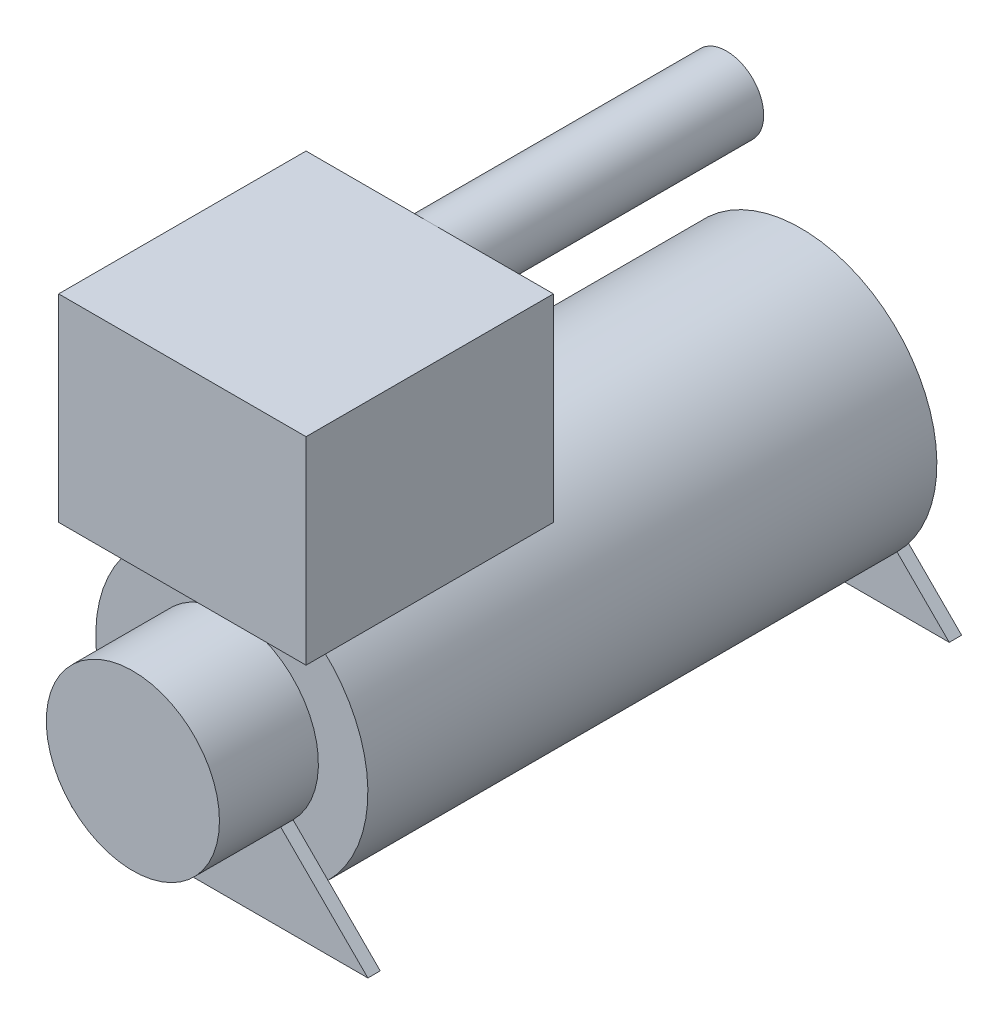
ISO-10303-21;
HEADER;
FILE_DESCRIPTION(('STEP AP214'),'2;1');
FILE_NAME('part.step','',(''),(''),'','','');
FILE_SCHEMA(('AUTOMOTIVE_DESIGN { 1 0 10303 214 1 1 1 1 }'));
ENDSEC;
DATA;
#1=APPLICATION_CONTEXT('core data for automotive mechanical design processes');
#2=APPLICATION_PROTOCOL_DEFINITION('international standard','automotive_design',2000,#1);
#3=PRODUCT_CONTEXT('',#1,'mechanical');
#4=PRODUCT('Part','Part','',(#3));
#5=PRODUCT_RELATED_PRODUCT_CATEGORY('part','',(#4));
#6=PRODUCT_DEFINITION_FORMATION('','',#4);
#7=PRODUCT_DEFINITION_CONTEXT('part definition',#1,'design');
#8=PRODUCT_DEFINITION('design','',#6,#7);
#9=PRODUCT_DEFINITION_SHAPE('','',#8);
#10=(LENGTH_UNIT() NAMED_UNIT(*) SI_UNIT(.MILLI.,.METRE.));
#11=(NAMED_UNIT(*) PLANE_ANGLE_UNIT() SI_UNIT($,.RADIAN.));
#12=(NAMED_UNIT(*) SI_UNIT($,.STERADIAN.) SOLID_ANGLE_UNIT());
#13=UNCERTAINTY_MEASURE_WITH_UNIT(LENGTH_MEASURE(1.E-05),#10,'distance_accuracy_value','');
#14=(GEOMETRIC_REPRESENTATION_CONTEXT(3) GLOBAL_UNCERTAINTY_ASSIGNED_CONTEXT((#13)) GLOBAL_UNIT_ASSIGNED_CONTEXT((#10,
#11,#12)) REPRESENTATION_CONTEXT('',''));
#15=CARTESIAN_POINT('',(0.,0.,0.));
#16=DIRECTION('',(0.,0.,1.));
#17=DIRECTION('',(1.,0.,0.));
#18=AXIS2_PLACEMENT_3D('',#15,#16,#17);
#19=CARTESIAN_POINT('',(0.,0.,146.05));
#20=DIRECTION('',(0.,0.,-1.));
#21=DIRECTION('',(-1.,0.,0.));
#22=AXIS2_PLACEMENT_3D('',#19,#20,#21);
#23=CYLINDRICAL_SURFACE('',#22,34.925);
#24=CARTESIAN_POINT('',(0.,0.,0.));
#25=DIRECTION('',(0.,0.,1.));
#26=DIRECTION('',(1.,0.,0.));
#27=AXIS2_PLACEMENT_3D('',#24,#25,#26);
#28=CIRCLE('',#27,34.925);
#29=CARTESIAN_POINT('',(-24.6957043329402,-24.6957043329402,0.));
#30=VERTEX_POINT('',#29);
#31=CARTESIAN_POINT('',(24.6957043329402,-24.6957043329402,0.));
#32=VERTEX_POINT('',#31);
#33=EDGE_CURVE('E256',#30,#32,#28,.T.);
#34=ORIENTED_EDGE('',*,*,#33,.T.);
#35=EDGE_CURVE('E250',#32,#30,#28,.T.);
#36=ORIENTED_EDGE('',*,*,#35,.T.);
#37=EDGE_LOOP('',(#34,#36));
#38=FACE_BOUND('',#37,.T.);
#39=DIRECTION('',(0.,0.,-1.));
#40=VECTOR('',#39,1.);
#41=CARTESIAN_POINT('',(11.3769602706523,33.02,146.05));
#42=LINE('',#41,#40);
#43=CARTESIAN_POINT('',(11.3769602706523,33.02,146.05));
#44=VERTEX_POINT('',#43);
#45=CARTESIAN_POINT('',(11.3769602706523,33.02,95.25));
#46=VERTEX_POINT('',#45);
#47=EDGE_CURVE('E191',#44,#46,#42,.T.);
#48=ORIENTED_EDGE('',*,*,#47,.F.);
#49=CARTESIAN_POINT('',(0.,0.,146.05));
#50=DIRECTION('',(0.,0.,1.));
#51=DIRECTION('',(1.,0.,0.));
#52=AXIS2_PLACEMENT_3D('',#49,#50,#51);
#53=CIRCLE('',#52,34.925);
#54=CARTESIAN_POINT('',(24.6957043329402,-24.6957043329402,146.05));
#55=VERTEX_POINT('',#54);
#56=EDGE_CURVE('E254',#55,#44,#53,.T.);
#57=ORIENTED_EDGE('',*,*,#56,.F.);
#58=CARTESIAN_POINT('',(-24.6957043329402,-24.6957043329402,146.05));
#59=VERTEX_POINT('',#58);
#60=EDGE_CURVE('E251',#59,#55,#53,.T.);
#61=ORIENTED_EDGE('',*,*,#60,.F.);
#62=CARTESIAN_POINT('',(-11.3769602706523,33.02,146.05));
#63=VERTEX_POINT('',#62);
#64=EDGE_CURVE('E255',#63,#59,#53,.T.);
#65=ORIENTED_EDGE('',*,*,#64,.F.);
#66=DIRECTION('',(0.,0.,-1.));
#67=VECTOR('',#66,1.);
#68=CARTESIAN_POINT('',(-11.3769602706523,33.02,146.05));
#69=LINE('',#68,#67);
#70=CARTESIAN_POINT('',(-11.3769602706523,33.02,95.25));
#71=VERTEX_POINT('',#70);
#72=EDGE_CURVE('E51',#71,#63,#69,.F.);
#73=ORIENTED_EDGE('',*,*,#72,.F.);
#74=CARTESIAN_POINT('',(0.,0.,95.25));
#75=DIRECTION('',(0.,0.,1.));
#76=DIRECTION('',(1.,0.,0.));
#77=AXIS2_PLACEMENT_3D('',#74,#75,#76);
#78=CIRCLE('',#77,34.925);
#79=EDGE_CURVE('E11',#46,#71,#78,.T.);
#80=ORIENTED_EDGE('',*,*,#79,.F.);
#81=EDGE_LOOP('',(#48,#57,#61,#65,#73,#80));
#82=FACE_BOUND('',#81,.T.);
#83=ADVANCED_FACE('F37',(#38,#82),#23,.T.);
#84=CARTESIAN_POINT('',(0.,0.,146.05));
#85=DIRECTION('',(0.,0.,1.));
#86=DIRECTION('',(1.,0.,0.));
#87=AXIS2_PLACEMENT_3D('',#84,#85,#86);
#88=PLANE('',#87);
#89=ORIENTED_EDGE('',*,*,#56,.T.);
#90=DIRECTION('',(-1.,0.,0.));
#91=VECTOR('',#90,1.);
#92=CARTESIAN_POINT('',(0.,33.02,146.05));
#93=LINE('',#92,#91);
#94=EDGE_CURVE('E44',#44,#63,#93,.T.);
#95=ORIENTED_EDGE('',*,*,#94,.T.);
#96=ORIENTED_EDGE('',*,*,#64,.T.);
#97=DIRECTION('',(-0.707106781186547,-0.707106781186547,0.));
#98=VECTOR('',#97,1.);
#99=CARTESIAN_POINT('',(0.,0.,146.05));
#100=LINE('',#99,#98);
#101=CARTESIAN_POINT('',(-15.715448211871,-15.715448211871,146.05));
#102=VERTEX_POINT('',#101);
#103=EDGE_CURVE('E241',#102,#59,#100,.T.);
#104=ORIENTED_EDGE('',*,*,#103,.F.);
#105=CARTESIAN_POINT('',(0.,0.,146.05));
#106=DIRECTION('',(0.,0.,1.));
#107=DIRECTION('',(1.,0.,0.));
#108=AXIS2_PLACEMENT_3D('',#105,#106,#107);
#109=CIRCLE('',#108,22.225);
#110=CARTESIAN_POINT('',(15.715448211871,-15.715448211871,146.05));
#111=VERTEX_POINT('',#110);
#112=EDGE_CURVE('E193',#111,#102,#109,.T.);
#113=ORIENTED_EDGE('',*,*,#112,.F.);
#114=DIRECTION('',(-0.707106781186547,0.707106781186547,0.));
#115=VECTOR('',#114,1.);
#116=CARTESIAN_POINT('',(38.1,-38.1,146.05));
#117=LINE('',#116,#115);
#118=EDGE_CURVE('E240',#55,#111,#117,.T.);
#119=ORIENTED_EDGE('',*,*,#118,.F.);
#120=EDGE_LOOP('',(#89,#95,#96,#104,#113,#119));
#121=FACE_BOUND('',#120,.T.);
#122=ADVANCED_FACE('F263',(#121),#88,.T.);
#123=CARTESIAN_POINT('',(38.1,-38.1,149.225));
#124=DIRECTION('',(-0.707106781186548,-0.707106781186548,0.));
#125=DIRECTION('',(0.707106781186548,-0.707106781186548,0.));
#126=AXIS2_PLACEMENT_3D('',#123,#124,#125);
#127=PLANE('',#126);
#128=DIRECTION('',(0.,0.,-1.));
#129=VECTOR('',#128,1.);
#130=CARTESIAN_POINT('',(15.715448211871,-15.715448211871,171.45));
#131=LINE('',#130,#129);
#132=CARTESIAN_POINT('',(15.715448211871,-15.715448211871,149.225));
#133=VERTEX_POINT('',#132);
#134=EDGE_CURVE('E199',#133,#111,#131,.T.);
#135=ORIENTED_EDGE('',*,*,#134,.F.);
#136=DIRECTION('',(-0.707106781186547,0.707106781186547,0.));
#137=VECTOR('',#136,1.);
#138=CARTESIAN_POINT('',(38.1,-38.1,149.225));
#139=LINE('',#138,#137);
#140=CARTESIAN_POINT('',(38.1,-38.1,149.225));
#141=VERTEX_POINT('',#140);
#142=EDGE_CURVE('E228',#141,#133,#139,.T.);
#143=ORIENTED_EDGE('',*,*,#142,.F.);
#144=DIRECTION('',(0.,0.,-1.));
#145=VECTOR('',#144,1.);
#146=CARTESIAN_POINT('',(38.1,-38.1,149.225));
#147=LINE('',#146,#145);
#148=CARTESIAN_POINT('',(38.1,-38.1,146.05));
#149=VERTEX_POINT('',#148);
#150=EDGE_CURVE('E236',#141,#149,#147,.T.);
#151=ORIENTED_EDGE('',*,*,#150,.T.);
#152=EDGE_CURVE('E227',#149,#55,#117,.T.);
#153=ORIENTED_EDGE('',*,*,#152,.T.);
#154=ORIENTED_EDGE('',*,*,#118,.T.);
#155=EDGE_LOOP('',(#135,#143,#151,#153,#154));
#156=FACE_BOUND('',#155,.T.);
#157=ADVANCED_FACE('F290',(#156),#127,.F.);
#158=CARTESIAN_POINT('',(0.,0.,149.225));
#159=DIRECTION('',(0.707106781186548,-0.707106781186548,0.));
#160=DIRECTION('',(0.707106781186548,0.707106781186548,0.));
#161=AXIS2_PLACEMENT_3D('',#158,#159,#160);
#162=PLANE('',#161);
#163=DIRECTION('',(0.,0.,-1.));
#164=VECTOR('',#163,1.);
#165=CARTESIAN_POINT('',(-15.715448211871,-15.715448211871,171.45));
#166=LINE('',#165,#164);
#167=CARTESIAN_POINT('',(-15.715448211871,-15.715448211871,149.225));
#168=VERTEX_POINT('',#167);
#169=EDGE_CURVE('E59',#102,#168,#166,.F.);
#170=ORIENTED_EDGE('',*,*,#169,.F.);
#171=ORIENTED_EDGE('',*,*,#103,.T.);
#172=CARTESIAN_POINT('',(-38.1,-38.1,146.05));
#173=VERTEX_POINT('',#172);
#174=EDGE_CURVE('E239',#59,#173,#100,.T.);
#175=ORIENTED_EDGE('',*,*,#174,.T.);
#176=DIRECTION('',(0.,0.,-1.));
#177=VECTOR('',#176,1.);
#178=CARTESIAN_POINT('',(-38.1,-38.1,149.225));
#179=LINE('',#178,#177);
#180=CARTESIAN_POINT('',(-38.1,-38.1,149.225));
#181=VERTEX_POINT('',#180);
#182=EDGE_CURVE('E247',#181,#173,#179,.T.);
#183=ORIENTED_EDGE('',*,*,#182,.F.);
#184=DIRECTION('',(-0.707106781186547,-0.707106781186547,0.));
#185=VECTOR('',#184,1.);
#186=CARTESIAN_POINT('',(0.,0.,149.225));
#187=LINE('',#186,#185);
#188=EDGE_CURVE('E231',#168,#181,#187,.T.);
#189=ORIENTED_EDGE('',*,*,#188,.F.);
#190=EDGE_LOOP('',(#170,#171,#175,#183,#189));
#191=FACE_BOUND('',#190,.T.);
#192=ADVANCED_FACE('F277',(#191),#162,.F.);
#193=CARTESIAN_POINT('',(0.,0.,0.));
#194=DIRECTION('',(0.,0.,1.));
#195=DIRECTION('',(1.,0.,0.));
#196=AXIS2_PLACEMENT_3D('',#193,#194,#195);
#197=PLANE('',#196);
#198=ORIENTED_EDGE('',*,*,#35,.F.);
#199=DIRECTION('',(-0.707106781186547,0.707106781186547,0.));
#200=VECTOR('',#199,1.);
#201=CARTESIAN_POINT('',(38.1,-38.1,0.));
#202=LINE('',#201,#200);
#203=CARTESIAN_POINT('',(0.,0.,0.));
#204=VERTEX_POINT('',#203);
#205=EDGE_CURVE('E207',#32,#204,#202,.T.);
#206=ORIENTED_EDGE('',*,*,#205,.T.);
#207=DIRECTION('',(-0.707106781186547,-0.707106781186547,0.));
#208=VECTOR('',#207,1.);
#209=CARTESIAN_POINT('',(0.,0.,0.));
#210=LINE('',#209,#208);
#211=EDGE_CURVE('E208',#204,#30,#210,.T.);
#212=ORIENTED_EDGE('',*,*,#211,.T.);
#213=EDGE_LOOP('',(#198,#206,#212));
#214=FACE_BOUND('',#213,.T.);
#215=ADVANCED_FACE('F294',(#214),#197,.F.);
#216=CARTESIAN_POINT('',(0.,0.,146.05));
#217=DIRECTION('',(0.,0.,1.));
#218=DIRECTION('',(1.,0.,0.));
#219=AXIS2_PLACEMENT_3D('',#216,#217,#218);
#220=PLANE('',#219);
#221=ORIENTED_EDGE('',*,*,#174,.F.);
#222=ORIENTED_EDGE('',*,*,#60,.T.);
#223=ORIENTED_EDGE('',*,*,#152,.F.);
#224=DIRECTION('',(1.,0.,0.));
#225=VECTOR('',#224,1.);
#226=CARTESIAN_POINT('',(38.1,-38.1,146.05));
#227=LINE('',#226,#225);
#228=EDGE_CURVE('E232',#173,#149,#227,.T.);
#229=ORIENTED_EDGE('',*,*,#228,.F.);
#230=EDGE_LOOP('',(#221,#222,#223,#229));
#231=FACE_BOUND('',#230,.T.);
#232=ADVANCED_FACE('F274',(#231),#220,.F.);
#233=CARTESIAN_POINT('',(38.1,-38.1,149.225));
#234=DIRECTION('',(0.,1.,0.));
#235=DIRECTION('',(0.,0.,1.));
#236=AXIS2_PLACEMENT_3D('',#233,#234,#235);
#237=PLANE('',#236);
#238=ORIENTED_EDGE('',*,*,#228,.T.);
#239=ORIENTED_EDGE('',*,*,#150,.F.);
#240=DIRECTION('',(1.,0.,0.));
#241=VECTOR('',#240,1.);
#242=CARTESIAN_POINT('',(38.1,-38.1,149.225));
#243=LINE('',#242,#241);
#244=EDGE_CURVE('E234',#181,#141,#243,.T.);
#245=ORIENTED_EDGE('',*,*,#244,.F.);
#246=ORIENTED_EDGE('',*,*,#182,.T.);
#247=EDGE_LOOP('',(#238,#239,#245,#246));
#248=FACE_BOUND('',#247,.T.);
#249=ADVANCED_FACE('F281',(#248),#237,.F.);
#250=CARTESIAN_POINT('',(0.,0.,149.225));
#251=DIRECTION('',(0.,0.,1.));
#252=DIRECTION('',(1.,0.,0.));
#253=AXIS2_PLACEMENT_3D('',#250,#251,#252);
#254=PLANE('',#253);
#255=ORIENTED_EDGE('',*,*,#142,.T.);
#256=CARTESIAN_POINT('',(0.,0.,149.225));
#257=DIRECTION('',(0.,0.,1.));
#258=DIRECTION('',(1.,0.,0.));
#259=AXIS2_PLACEMENT_3D('',#256,#257,#258);
#260=CIRCLE('',#259,22.225);
#261=EDGE_CURVE('E259',#133,#168,#260,.F.);
#262=ORIENTED_EDGE('',*,*,#261,.T.);
#263=ORIENTED_EDGE('',*,*,#188,.T.);
#264=ORIENTED_EDGE('',*,*,#244,.T.);
#265=EDGE_LOOP('',(#255,#262,#263,#264));
#266=FACE_BOUND('',#265,.T.);
#267=ADVANCED_FACE('F285',(#266),#254,.T.);
#268=CARTESIAN_POINT('',(0.,0.,0.));
#269=DIRECTION('',(0.,0.,1.));
#270=DIRECTION('',(1.,0.,0.));
#271=AXIS2_PLACEMENT_3D('',#268,#269,#270);
#272=PLANE('',#271);
#273=ORIENTED_EDGE('',*,*,#33,.F.);
#274=CARTESIAN_POINT('',(-38.1,-38.1,0.));
#275=VERTEX_POINT('',#274);
#276=EDGE_CURVE('E205',#30,#275,#210,.T.);
#277=ORIENTED_EDGE('',*,*,#276,.T.);
#278=DIRECTION('',(1.,0.,0.));
#279=VECTOR('',#278,1.);
#280=CARTESIAN_POINT('',(38.1,-38.1,0.));
#281=LINE('',#280,#279);
#282=CARTESIAN_POINT('',(38.1,-38.1,0.));
#283=VERTEX_POINT('',#282);
#284=EDGE_CURVE('E211',#275,#283,#281,.T.);
#285=ORIENTED_EDGE('',*,*,#284,.T.);
#286=EDGE_CURVE('E202',#283,#32,#202,.T.);
#287=ORIENTED_EDGE('',*,*,#286,.T.);
#288=EDGE_LOOP('',(#273,#277,#285,#287));
#289=FACE_BOUND('',#288,.T.);
#290=ADVANCED_FACE('F302',(#289),#272,.T.);
#291=CARTESIAN_POINT('',(38.1,-38.1,0.));
#292=DIRECTION('',(-0.707106781186548,-0.707106781186548,0.));
#293=DIRECTION('',(0.707106781186548,-0.707106781186548,0.));
#294=AXIS2_PLACEMENT_3D('',#291,#292,#293);
#295=PLANE('',#294);
#296=DIRECTION('',(-0.707106781186547,0.707106781186547,0.));
#297=VECTOR('',#296,1.);
#298=CARTESIAN_POINT('',(38.1,-38.1,-3.17500000000001));
#299=LINE('',#298,#297);
#300=CARTESIAN_POINT('',(38.1,-38.1,-3.17500000000001));
#301=VERTEX_POINT('',#300);
#302=CARTESIAN_POINT('',(0.,0.,-3.17500000000001));
#303=VERTEX_POINT('',#302);
#304=EDGE_CURVE('E201',#301,#303,#299,.T.);
#305=ORIENTED_EDGE('',*,*,#304,.T.);
#306=DIRECTION('',(0.,0.,-1.));
#307=VECTOR('',#306,1.);
#308=CARTESIAN_POINT('',(0.,0.,0.));
#309=LINE('',#308,#307);
#310=EDGE_CURVE('E224',#204,#303,#309,.T.);
#311=ORIENTED_EDGE('',*,*,#310,.F.);
#312=ORIENTED_EDGE('',*,*,#205,.F.);
#313=ORIENTED_EDGE('',*,*,#286,.F.);
#314=DIRECTION('',(0.,0.,-1.));
#315=VECTOR('',#314,1.);
#316=CARTESIAN_POINT('',(38.1,-38.1,0.));
#317=LINE('',#316,#315);
#318=EDGE_CURVE('E213',#283,#301,#317,.T.);
#319=ORIENTED_EDGE('',*,*,#318,.T.);
#320=EDGE_LOOP('',(#305,#311,#312,#313,#319));
#321=FACE_BOUND('',#320,.T.);
#322=ADVANCED_FACE('F299',(#321),#295,.F.);
#323=CARTESIAN_POINT('',(0.,0.,0.));
#324=DIRECTION('',(0.707106781186548,-0.707106781186548,0.));
#325=DIRECTION('',(0.707106781186548,0.707106781186548,0.));
#326=AXIS2_PLACEMENT_3D('',#323,#324,#325);
#327=PLANE('',#326);
#328=DIRECTION('',(-0.707106781186547,-0.707106781186547,0.));
#329=VECTOR('',#328,1.);
#330=CARTESIAN_POINT('',(0.,0.,-3.17500000000001));
#331=LINE('',#330,#329);
#332=CARTESIAN_POINT('',(-38.1,-38.1,-3.17500000000001));
#333=VERTEX_POINT('',#332);
#334=EDGE_CURVE('E216',#303,#333,#331,.T.);
#335=ORIENTED_EDGE('',*,*,#334,.T.);
#336=DIRECTION('',(0.,0.,-1.));
#337=VECTOR('',#336,1.);
#338=CARTESIAN_POINT('',(-38.1,-38.1,0.));
#339=LINE('',#338,#337);
#340=EDGE_CURVE('E221',#275,#333,#339,.T.);
#341=ORIENTED_EDGE('',*,*,#340,.F.);
#342=ORIENTED_EDGE('',*,*,#276,.F.);
#343=ORIENTED_EDGE('',*,*,#211,.F.);
#344=ORIENTED_EDGE('',*,*,#310,.T.);
#345=EDGE_LOOP('',(#335,#341,#342,#343,#344));
#346=FACE_BOUND('',#345,.T.);
#347=ADVANCED_FACE('F313',(#346),#327,.F.);
#348=CARTESIAN_POINT('',(38.1,-38.1,0.));
#349=DIRECTION('',(0.,1.,0.));
#350=DIRECTION('',(0.,0.,1.));
#351=AXIS2_PLACEMENT_3D('',#348,#349,#350);
#352=PLANE('',#351);
#353=DIRECTION('',(1.,0.,0.));
#354=VECTOR('',#353,1.);
#355=CARTESIAN_POINT('',(38.1,-38.1,-3.17500000000001));
#356=LINE('',#355,#354);
#357=EDGE_CURVE('E206',#333,#301,#356,.T.);
#358=ORIENTED_EDGE('',*,*,#357,.T.);
#359=ORIENTED_EDGE('',*,*,#318,.F.);
#360=ORIENTED_EDGE('',*,*,#284,.F.);
#361=ORIENTED_EDGE('',*,*,#340,.T.);
#362=EDGE_LOOP('',(#358,#359,#360,#361));
#363=FACE_BOUND('',#362,.T.);
#364=ADVANCED_FACE('F307',(#363),#352,.F.);
#365=CARTESIAN_POINT('',(0.,0.,-3.17500000000001));
#366=DIRECTION('',(0.,0.,1.));
#367=DIRECTION('',(1.,0.,0.));
#368=AXIS2_PLACEMENT_3D('',#365,#366,#367);
#369=PLANE('',#368);
#370=ORIENTED_EDGE('',*,*,#304,.F.);
#371=ORIENTED_EDGE('',*,*,#357,.F.);
#372=ORIENTED_EDGE('',*,*,#334,.F.);
#373=EDGE_LOOP('',(#370,#371,#372));
#374=FACE_BOUND('',#373,.T.);
#375=ADVANCED_FACE('F311',(#374),#369,.F.);
#376=CARTESIAN_POINT('',(0.,0.,171.45));
#377=DIRECTION('',(0.,0.,-1.));
#378=DIRECTION('',(-1.,0.,0.));
#379=AXIS2_PLACEMENT_3D('',#376,#377,#378);
#380=CYLINDRICAL_SURFACE('',#379,22.225);
#381=CARTESIAN_POINT('',(0.,0.,171.45));
#382=DIRECTION('',(0.,0.,1.));
#383=DIRECTION('',(1.,0.,0.));
#384=AXIS2_PLACEMENT_3D('',#381,#382,#383);
#385=CIRCLE('',#384,22.225);
#386=CARTESIAN_POINT('',(22.225,0.,171.45));
#387=VERTEX_POINT('',#386);
#388=EDGE_CURVE('E194',#387,#387,#385,.T.);
#389=ORIENTED_EDGE('',*,*,#388,.F.);
#390=EDGE_LOOP('',(#389));
#391=FACE_BOUND('',#390,.T.);
#392=ORIENTED_EDGE('',*,*,#261,.F.);
#393=ORIENTED_EDGE('',*,*,#134,.T.);
#394=ORIENTED_EDGE('',*,*,#112,.T.);
#395=ORIENTED_EDGE('',*,*,#169,.T.);
#396=EDGE_LOOP('',(#392,#393,#394,#395));
#397=FACE_BOUND('',#396,.T.);
#398=ADVANCED_FACE('F353',(#391,#397),#380,.T.);
#399=CARTESIAN_POINT('',(0.,0.,171.45));
#400=DIRECTION('',(0.,0.,1.));
#401=DIRECTION('',(1.,0.,0.));
#402=AXIS2_PLACEMENT_3D('',#399,#400,#401);
#403=PLANE('',#402);
#404=ORIENTED_EDGE('',*,*,#388,.T.);
#405=EDGE_LOOP('',(#404));
#406=FACE_BOUND('',#405,.T.);
#407=ADVANCED_FACE('F359',(#406),#403,.T.);
#408=CARTESIAN_POINT('',(0.,33.02,0.));
#409=DIRECTION('',(0.,1.,0.));
#410=DIRECTION('',(0.,0.,1.));
#411=AXIS2_PLACEMENT_3D('',#408,#409,#410);
#412=PLANE('',#411);
#413=ORIENTED_EDGE('',*,*,#94,.F.);
#414=ORIENTED_EDGE('',*,*,#47,.T.);
#415=DIRECTION('',(-1.,0.,0.));
#416=VECTOR('',#415,1.);
#417=CARTESIAN_POINT('',(-31.75,33.02,95.25));
#418=LINE('',#417,#416);
#419=CARTESIAN_POINT('',(31.75,33.02,95.25));
#420=VERTEX_POINT('',#419);
#421=EDGE_CURVE('E177',#420,#46,#418,.T.);
#422=ORIENTED_EDGE('',*,*,#421,.F.);
#423=DIRECTION('',(0.,0.,-1.));
#424=VECTOR('',#423,1.);
#425=CARTESIAN_POINT('',(31.75,33.02,95.25));
#426=LINE('',#425,#424);
#427=CARTESIAN_POINT('',(31.75,33.02,158.75));
#428=VERTEX_POINT('',#427);
#429=EDGE_CURVE('E174',#428,#420,#426,.T.);
#430=ORIENTED_EDGE('',*,*,#429,.F.);
#431=DIRECTION('',(1.,0.,0.));
#432=VECTOR('',#431,1.);
#433=CARTESIAN_POINT('',(-31.75,33.02,158.75));
#434=LINE('',#433,#432);
#435=CARTESIAN_POINT('',(-31.75,33.02,158.75));
#436=VERTEX_POINT('',#435);
#437=EDGE_CURVE('E171',#436,#428,#434,.T.);
#438=ORIENTED_EDGE('',*,*,#437,.F.);
#439=DIRECTION('',(0.,0.,1.));
#440=VECTOR('',#439,1.);
#441=CARTESIAN_POINT('',(-31.75,33.02,95.25));
#442=LINE('',#441,#440);
#443=CARTESIAN_POINT('',(-31.75,33.02,95.25));
#444=VERTEX_POINT('',#443);
#445=EDGE_CURVE('E168',#444,#436,#442,.T.);
#446=ORIENTED_EDGE('',*,*,#445,.F.);
#447=EDGE_CURVE('E176',#71,#444,#418,.T.);
#448=ORIENTED_EDGE('',*,*,#447,.F.);
#449=ORIENTED_EDGE('',*,*,#72,.T.);
#450=EDGE_LOOP('',(#413,#414,#422,#430,#438,#446,#448,#449));
#451=FACE_BOUND('',#450,.T.);
#452=ADVANCED_FACE('F364',(#451),#412,.F.);
#453=CARTESIAN_POINT('',(-31.75,83.82,95.25));
#454=DIRECTION('',(1.,0.,0.));
#455=DIRECTION('',(0.,0.,-1.));
#456=AXIS2_PLACEMENT_3D('',#453,#454,#455);
#457=PLANE('',#456);
#458=ORIENTED_EDGE('',*,*,#445,.T.);
#459=DIRECTION('',(0.,-1.,0.));
#460=VECTOR('',#459,1.);
#461=CARTESIAN_POINT('',(-31.75,83.82,158.75));
#462=LINE('',#461,#460);
#463=CARTESIAN_POINT('',(-31.75,83.82,158.75));
#464=VERTEX_POINT('',#463);
#465=EDGE_CURVE('E187',#464,#436,#462,.T.);
#466=ORIENTED_EDGE('',*,*,#465,.F.);
#467=DIRECTION('',(0.,0.,1.));
#468=VECTOR('',#467,1.);
#469=CARTESIAN_POINT('',(-31.75,83.82,95.25));
#470=LINE('',#469,#468);
#471=CARTESIAN_POINT('',(-31.75,83.82,95.25));
#472=VERTEX_POINT('',#471);
#473=EDGE_CURVE('E180',#472,#464,#470,.T.);
#474=ORIENTED_EDGE('',*,*,#473,.F.);
#475=DIRECTION('',(0.,-1.,0.));
#476=VECTOR('',#475,1.);
#477=CARTESIAN_POINT('',(-31.75,83.82,95.25));
#478=LINE('',#477,#476);
#479=EDGE_CURVE('E157',#472,#444,#478,.T.);
#480=ORIENTED_EDGE('',*,*,#479,.T.);
#481=EDGE_LOOP('',(#458,#466,#474,#480));
#482=FACE_BOUND('',#481,.T.);
#483=ADVANCED_FACE('F370',(#482),#457,.F.);
#484=CARTESIAN_POINT('',(-31.75,83.82,158.75));
#485=DIRECTION('',(0.,0.,-1.));
#486=DIRECTION('',(-1.,0.,0.));
#487=AXIS2_PLACEMENT_3D('',#484,#485,#486);
#488=PLANE('',#487);
#489=ORIENTED_EDGE('',*,*,#437,.T.);
#490=DIRECTION('',(0.,-1.,0.));
#491=VECTOR('',#490,1.);
#492=CARTESIAN_POINT('',(31.75,83.82,158.75));
#493=LINE('',#492,#491);
#494=CARTESIAN_POINT('',(31.75,83.82,158.75));
#495=VERTEX_POINT('',#494);
#496=EDGE_CURVE('E184',#495,#428,#493,.T.);
#497=ORIENTED_EDGE('',*,*,#496,.F.);
#498=DIRECTION('',(1.,0.,0.));
#499=VECTOR('',#498,1.);
#500=CARTESIAN_POINT('',(-31.75,83.82,158.75));
#501=LINE('',#500,#499);
#502=EDGE_CURVE('E164',#464,#495,#501,.T.);
#503=ORIENTED_EDGE('',*,*,#502,.F.);
#504=ORIENTED_EDGE('',*,*,#465,.T.);
#505=EDGE_LOOP('',(#489,#497,#503,#504));
#506=FACE_BOUND('',#505,.T.);
#507=ADVANCED_FACE('F375',(#506),#488,.F.);
#508=CARTESIAN_POINT('',(31.75,83.82,95.25));
#509=DIRECTION('',(-1.,0.,0.));
#510=DIRECTION('',(0.,0.,1.));
#511=AXIS2_PLACEMENT_3D('',#508,#509,#510);
#512=PLANE('',#511);
#513=ORIENTED_EDGE('',*,*,#429,.T.);
#514=DIRECTION('',(0.,-1.,0.));
#515=VECTOR('',#514,1.);
#516=CARTESIAN_POINT('',(31.75,83.82,95.25));
#517=LINE('',#516,#515);
#518=CARTESIAN_POINT('',(31.75,83.82,95.25));
#519=VERTEX_POINT('',#518);
#520=EDGE_CURVE('E182',#519,#420,#517,.T.);
#521=ORIENTED_EDGE('',*,*,#520,.F.);
#522=DIRECTION('',(0.,0.,-1.));
#523=VECTOR('',#522,1.);
#524=CARTESIAN_POINT('',(31.75,83.82,95.25));
#525=LINE('',#524,#523);
#526=EDGE_CURVE('E152',#495,#519,#525,.T.);
#527=ORIENTED_EDGE('',*,*,#526,.F.);
#528=ORIENTED_EDGE('',*,*,#496,.T.);
#529=EDGE_LOOP('',(#513,#521,#527,#528));
#530=FACE_BOUND('',#529,.T.);
#531=ADVANCED_FACE('F379',(#530),#512,.F.);
#532=CARTESIAN_POINT('',(-31.75,83.82,95.25));
#533=DIRECTION('',(0.,0.,1.));
#534=DIRECTION('',(1.,0.,0.));
#535=AXIS2_PLACEMENT_3D('',#532,#533,#534);
#536=PLANE('',#535);
#537=DIRECTION('',(-1.,0.,0.));
#538=VECTOR('',#537,1.);
#539=CARTESIAN_POINT('',(-31.75,83.82,95.25));
#540=LINE('',#539,#538);
#541=CARTESIAN_POINT('',(0.,83.82,95.25));
#542=VERTEX_POINT('',#541);
#543=EDGE_CURVE('E149',#542,#472,#540,.T.);
#544=ORIENTED_EDGE('',*,*,#543,.F.);
#545=CARTESIAN_POINT('',(0.,74.295,95.25));
#546=DIRECTION('',(0.,0.,-1.));
#547=DIRECTION('',(-1.,0.,0.));
#548=AXIS2_PLACEMENT_3D('',#545,#546,#547);
#549=CIRCLE('',#548,9.525);
#550=EDGE_CURVE('E161',#542,#542,#549,.T.);
#551=ORIENTED_EDGE('',*,*,#550,.F.);
#552=EDGE_CURVE('E145',#519,#542,#540,.T.);
#553=ORIENTED_EDGE('',*,*,#552,.F.);
#554=ORIENTED_EDGE('',*,*,#520,.T.);
#555=ORIENTED_EDGE('',*,*,#421,.T.);
#556=ORIENTED_EDGE('',*,*,#79,.T.);
#557=ORIENTED_EDGE('',*,*,#447,.T.);
#558=ORIENTED_EDGE('',*,*,#479,.F.);
#559=EDGE_LOOP('',(#544,#551,#553,#554,#555,#556,#557,#558));
#560=FACE_BOUND('',#559,.T.);
#561=ADVANCED_FACE('F159',(#560),#536,.F.);
#562=CARTESIAN_POINT('',(0.,83.82,0.));
#563=DIRECTION('',(0.,1.,0.));
#564=DIRECTION('',(0.,0.,1.));
#565=AXIS2_PLACEMENT_3D('',#562,#563,#564);
#566=PLANE('',#565);
#567=ORIENTED_EDGE('',*,*,#473,.T.);
#568=ORIENTED_EDGE('',*,*,#502,.T.);
#569=ORIENTED_EDGE('',*,*,#526,.T.);
#570=ORIENTED_EDGE('',*,*,#552,.T.);
#571=ORIENTED_EDGE('',*,*,#543,.T.);
#572=EDGE_LOOP('',(#567,#568,#569,#570,#571));
#573=FACE_BOUND('',#572,.T.);
#574=ADVANCED_FACE('F148',(#573),#566,.T.);
#575=CARTESIAN_POINT('',(0.,74.295,19.05));
#576=DIRECTION('',(0.,0.,1.));
#577=DIRECTION('',(1.,0.,0.));
#578=AXIS2_PLACEMENT_3D('',#575,#576,#577);
#579=CYLINDRICAL_SURFACE('',#578,9.525);
#580=CARTESIAN_POINT('',(0.,74.295,19.05));
#581=DIRECTION('',(0.,0.,-1.));
#582=DIRECTION('',(-1.,0.,0.));
#583=AXIS2_PLACEMENT_3D('',#580,#581,#582);
#584=CIRCLE('',#583,9.525);
#585=CARTESIAN_POINT('',(-9.525,74.295,19.05));
#586=VERTEX_POINT('',#585);
#587=EDGE_CURVE('E172',#586,#586,#584,.T.);
#588=ORIENTED_EDGE('',*,*,#587,.F.);
#589=EDGE_LOOP('',(#588));
#590=FACE_BOUND('',#589,.T.);
#591=ORIENTED_EDGE('',*,*,#550,.T.);
#592=EDGE_LOOP('',(#591));
#593=FACE_BOUND('',#592,.T.);
#594=ADVANCED_FACE('F388',(#590,#593),#579,.T.);
#595=CARTESIAN_POINT('',(0.,74.295,19.05));
#596=DIRECTION('',(0.,0.,-1.));
#597=DIRECTION('',(-1.,0.,0.));
#598=AXIS2_PLACEMENT_3D('',#595,#596,#597);
#599=PLANE('',#598);
#600=ORIENTED_EDGE('',*,*,#587,.T.);
#601=EDGE_LOOP('',(#600));
#602=FACE_BOUND('',#601,.T.);
#603=ADVANCED_FACE('F391',(#602),#599,.T.);
#604=CLOSED_SHELL('',(#83,#122,#157,#192,#215,#232,#249,#267,#290,#322,#347,#364,#375,#398,#407,
#452,#483,#507,#531,#561,#574,#594,#603));
#605=MANIFOLD_SOLID_BREP('B2',#604);
#606=ADVANCED_BREP_SHAPE_REPRESENTATION('',(#18,#605),#14);
#607=SHAPE_DEFINITION_REPRESENTATION(#9,#606);
ENDSEC;
END-ISO-10303-21;
